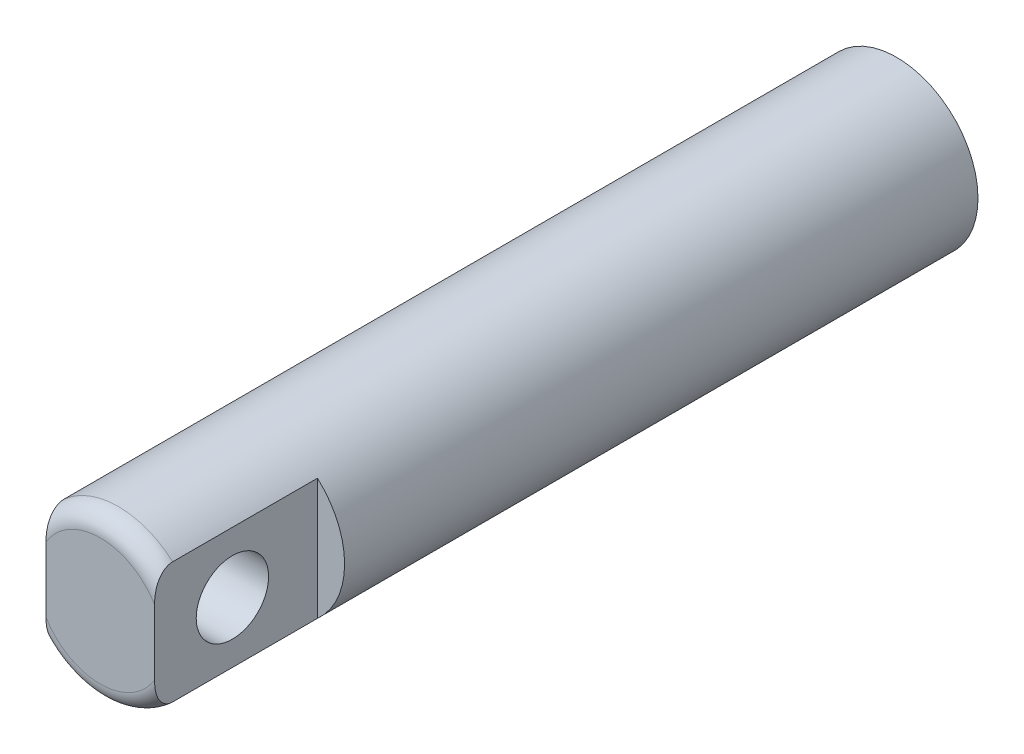
ISO-10303-21;
HEADER;
FILE_DESCRIPTION(('STEP AP214'),'2;1');
FILE_NAME('part.step','',(''),(''),'','','');
FILE_SCHEMA(('AUTOMOTIVE_DESIGN { 1 0 10303 214 1 1 1 1 }'));
ENDSEC;
DATA;
#1=APPLICATION_CONTEXT('core data for automotive mechanical design processes');
#2=APPLICATION_PROTOCOL_DEFINITION('international standard','automotive_design',2000,#1);
#3=PRODUCT_CONTEXT('',#1,'mechanical');
#4=PRODUCT('Part','Part','',(#3));
#5=PRODUCT_RELATED_PRODUCT_CATEGORY('part','',(#4));
#6=PRODUCT_DEFINITION_FORMATION('','',#4);
#7=PRODUCT_DEFINITION_CONTEXT('part definition',#1,'design');
#8=PRODUCT_DEFINITION('design','',#6,#7);
#9=PRODUCT_DEFINITION_SHAPE('','',#8);
#10=(LENGTH_UNIT() NAMED_UNIT(*) SI_UNIT(.MILLI.,.METRE.));
#11=(NAMED_UNIT(*) PLANE_ANGLE_UNIT() SI_UNIT($,.RADIAN.));
#12=(NAMED_UNIT(*) SI_UNIT($,.STERADIAN.) SOLID_ANGLE_UNIT());
#13=UNCERTAINTY_MEASURE_WITH_UNIT(LENGTH_MEASURE(1.E-05),#10,'distance_accuracy_value','');
#14=(GEOMETRIC_REPRESENTATION_CONTEXT(3) GLOBAL_UNCERTAINTY_ASSIGNED_CONTEXT((#13)) GLOBAL_UNIT_ASSIGNED_CONTEXT((#10,
#11,#12)) REPRESENTATION_CONTEXT('',''));
#15=CARTESIAN_POINT('',(0.,0.,0.));
#16=DIRECTION('',(0.,0.,1.));
#17=DIRECTION('',(1.,0.,0.));
#18=AXIS2_PLACEMENT_3D('',#15,#16,#17);
#19=CARTESIAN_POINT('',(0.,0.,35.));
#20=DIRECTION('',(0.,0.,1.));
#21=DIRECTION('',(1.,0.,0.));
#22=AXIS2_PLACEMENT_3D('',#19,#20,#21);
#23=PLANE('',#22);
#24=CARTESIAN_POINT('',(0.,0.,35.));
#25=DIRECTION('',(0.,0.,1.));
#26=DIRECTION('',(1.,0.,0.));
#27=AXIS2_PLACEMENT_3D('',#24,#25,#26);
#28=CIRCLE('',#27,4.5);
#29=CARTESIAN_POINT('',(-3.,3.35410196624968,35.));
#30=VERTEX_POINT('',#29);
#31=CARTESIAN_POINT('',(-3.,-3.35410196624968,35.));
#32=VERTEX_POINT('',#31);
#33=EDGE_CURVE('E97',#30,#32,#28,.T.);
#34=ORIENTED_EDGE('',*,*,#33,.T.);
#35=DIRECTION('',(0.,1.,0.));
#36=VECTOR('',#35,1.);
#37=CARTESIAN_POINT('',(-3.,0.,35.));
#38=LINE('',#37,#36);
#39=EDGE_CURVE('E103',#32,#30,#38,.T.);
#40=ORIENTED_EDGE('',*,*,#39,.T.);
#41=EDGE_LOOP('',(#34,#40));
#42=FACE_BOUND('',#41,.T.);
#43=ADVANCED_FACE('F36',(#42),#23,.T.);
#44=CARTESIAN_POINT('',(0.,0.,35.));
#45=DIRECTION('',(0.,0.,-1.));
#46=DIRECTION('',(-1.,0.,0.));
#47=AXIS2_PLACEMENT_3D('',#44,#45,#46);
#48=CYLINDRICAL_SURFACE('',#47,4.5);
#49=DIRECTION('',(0.,0.,-1.));
#50=VECTOR('',#49,1.);
#51=CARTESIAN_POINT('',(3.,-3.35410196624968,44.));
#52=LINE('',#51,#50);
#53=CARTESIAN_POINT('',(3.,-3.35410196624968,43.));
#54=VERTEX_POINT('',#53);
#55=CARTESIAN_POINT('',(3.,-3.35410196624968,35.));
#56=VERTEX_POINT('',#55);
#57=EDGE_CURVE('E100',#54,#56,#52,.T.);
#58=ORIENTED_EDGE('',*,*,#57,.F.);
#59=CARTESIAN_POINT('',(0.,0.,43.));
#60=DIRECTION('',(0.,0.,1.));
#61=DIRECTION('',(1.,0.,0.));
#62=AXIS2_PLACEMENT_3D('',#59,#60,#61);
#63=CIRCLE('',#62,4.5);
#64=CARTESIAN_POINT('',(-3.,-3.35410196624968,43.));
#65=VERTEX_POINT('',#64);
#66=EDGE_CURVE('E57',#54,#65,#63,.F.);
#67=ORIENTED_EDGE('',*,*,#66,.T.);
#68=DIRECTION('',(0.,0.,-1.));
#69=VECTOR('',#68,1.);
#70=CARTESIAN_POINT('',(-3.,-3.35410196624968,44.));
#71=LINE('',#70,#69);
#72=EDGE_CURVE('E92',#65,#32,#71,.T.);
#73=ORIENTED_EDGE('',*,*,#72,.T.);
#74=ORIENTED_EDGE('',*,*,#33,.F.);
#75=DIRECTION('',(0.,0.,-1.));
#76=VECTOR('',#75,1.);
#77=CARTESIAN_POINT('',(-3.,3.35410196624968,44.));
#78=LINE('',#77,#76);
#79=CARTESIAN_POINT('',(-3.,3.35410196624968,43.));
#80=VERTEX_POINT('',#79);
#81=EDGE_CURVE('E99',#80,#30,#78,.T.);
#82=ORIENTED_EDGE('',*,*,#81,.F.);
#83=CARTESIAN_POINT('',(0.,0.,43.));
#84=DIRECTION('',(0.,0.,1.));
#85=DIRECTION('',(1.,0.,0.));
#86=AXIS2_PLACEMENT_3D('',#83,#84,#85);
#87=CIRCLE('',#86,4.5);
#88=CARTESIAN_POINT('',(3.,3.35410196624968,43.));
#89=VERTEX_POINT('',#88);
#90=EDGE_CURVE('E160',#80,#89,#87,.F.);
#91=ORIENTED_EDGE('',*,*,#90,.T.);
#92=DIRECTION('',(0.,0.,-1.));
#93=VECTOR('',#92,1.);
#94=CARTESIAN_POINT('',(3.,3.35410196624968,44.));
#95=LINE('',#94,#93);
#96=CARTESIAN_POINT('',(3.,3.35410196624968,35.));
#97=VERTEX_POINT('',#96);
#98=EDGE_CURVE('E172',#89,#97,#95,.T.);
#99=ORIENTED_EDGE('',*,*,#98,.T.);
#100=EDGE_CURVE('E110',#56,#97,#28,.T.);
#101=ORIENTED_EDGE('',*,*,#100,.F.);
#102=EDGE_LOOP('',(#58,#67,#73,#74,#82,#91,#99,#101));
#103=FACE_BOUND('',#102,.T.);
#104=CARTESIAN_POINT('',(0.,0.,0.));
#105=DIRECTION('',(0.,0.,1.));
#106=DIRECTION('',(1.,0.,0.));
#107=AXIS2_PLACEMENT_3D('',#104,#105,#106);
#108=CIRCLE('',#107,4.5);
#109=CARTESIAN_POINT('',(4.5,0.,0.));
#110=VERTEX_POINT('',#109);
#111=EDGE_CURVE('E116',#110,#110,#108,.T.);
#112=ORIENTED_EDGE('',*,*,#111,.T.);
#113=EDGE_LOOP('',(#112));
#114=FACE_BOUND('',#113,.T.);
#115=ADVANCED_FACE('F94',(#103,#114),#48,.T.);
#116=DIRECTION('',(0.,1.,0.));
#117=VECTOR('',#116,1.);
#118=CARTESIAN_POINT('',(3.,0.,35.));
#119=LINE('',#118,#117);
#120=EDGE_CURVE('E106',#56,#97,#119,.T.);
#121=ORIENTED_EDGE('',*,*,#120,.F.);
#122=ORIENTED_EDGE('',*,*,#100,.T.);
#123=EDGE_LOOP('',(#121,#122));
#124=FACE_BOUND('',#123,.T.);
#125=ADVANCED_FACE('F152',(#124),#23,.T.);
#126=CARTESIAN_POINT('',(0.,0.,0.));
#127=DIRECTION('',(0.,0.,1.));
#128=DIRECTION('',(1.,0.,0.));
#129=AXIS2_PLACEMENT_3D('',#126,#127,#128);
#130=PLANE('',#129);
#131=ORIENTED_EDGE('',*,*,#111,.F.);
#132=EDGE_LOOP('',(#131));
#133=FACE_BOUND('',#132,.T.);
#134=ADVANCED_FACE('F150',(#133),#130,.F.);
#135=CARTESIAN_POINT('',(-3.,0.,44.));
#136=DIRECTION('',(-1.,0.,0.));
#137=DIRECTION('',(0.,0.,1.));
#138=AXIS2_PLACEMENT_3D('',#135,#136,#137);
#139=PLANE('',#138);
#140=CARTESIAN_POINT('',(-3.,0.,39.7));
#141=DIRECTION('',(-1.,0.,0.));
#142=DIRECTION('',(0.,0.,1.));
#143=AXIS2_PLACEMENT_3D('',#140,#141,#142);
#144=CIRCLE('',#143,2.);
#145=CARTESIAN_POINT('',(-3.,0.,41.7));
#146=VERTEX_POINT('',#145);
#147=EDGE_CURVE('E122',#146,#146,#144,.T.);
#148=ORIENTED_EDGE('',*,*,#147,.F.);
#149=EDGE_LOOP('',(#148));
#150=FACE_BOUND('',#149,.T.);
#151=ORIENTED_EDGE('',*,*,#72,.F.);
#152=CARTESIAN_POINT('',(-3.,-3.35410196624968,43.));
#153=CARTESIAN_POINT('',(-3.,-3.35410454903501,43.0227438625371));
#154=CARTESIAN_POINT('',(-3.,-3.35306009469318,43.0454749001638));
#155=CARTESIAN_POINT('',(-3.,-3.34891222657833,43.0907369708359));
#156=CARTESIAN_POINT('',(-3.,-3.34580985988294,43.1132680996912));
#157=CARTESIAN_POINT('',(-3.,-3.33352701165953,43.1800084670912));
#158=CARTESIAN_POINT('',(-3.,-3.32136959422299,43.2237015706051));
#159=CARTESIAN_POINT('',(-3.,-3.28985961248155,43.3082718676722));
#160=CARTESIAN_POINT('',(-3.,-3.27051886023211,43.3491535541598));
#161=CARTESIAN_POINT('',(-3.,-3.22563998320875,43.4274112040965));
#162=CARTESIAN_POINT('',(-3.,-3.20009153278447,43.4647811811681));
#163=CARTESIAN_POINT('',(-3.,-3.13519094673913,43.5464202089613));
#164=CARTESIAN_POINT('',(-3.,-3.09401470318977,43.5892380899997));
#165=CARTESIAN_POINT('',(-3.,-3.00528363023168,43.6675578784426));
#166=CARTESIAN_POINT('',(-3.,-2.95772326044216,43.7030533625526));
#167=CARTESIAN_POINT('',(-3.,-2.83879019866428,43.7794086367998));
#168=CARTESIAN_POINT('',(-3.,-2.76533540443195,43.8170109743537));
#169=CARTESIAN_POINT('',(-3.,-2.61322737961961,43.880326582716));
#170=CARTESIAN_POINT('',(-3.,-2.53454852125631,43.9059753973865));
#171=CARTESIAN_POINT('',(-3.,-2.34752333041213,43.9540625323204));
#172=CARTESIAN_POINT('',(-3.,-2.23815778385163,43.9724682091914));
#173=CARTESIAN_POINT('',(-3.,-2.07412278259901,43.9896598751466));
#174=CARTESIAN_POINT('',(-3.,-2.01986832136679,43.9936624497555));
#175=CARTESIAN_POINT('',(-3.,-1.91133646557868,43.9988264692374));
#176=CARTESIAN_POINT('',(-3.,-1.85705936934241,43.9999939844098));
#177=CARTESIAN_POINT('',(-3.,-1.80277563773199,44.));
#178=B_SPLINE_CURVE_WITH_KNOTS('',3,(#152,#153,#154,#155,#156,#157,#158,#159,#160,#161,#162,
#163,#164,#165,#166,#167,#168,#169,#170,#171,#172,#173,#174,#175,#176,#177),.UNSPECIFIED.,.F.,
.F.,(4,2,2,2,2,2,2,2,2,2,2,2,4),(0.,0.0681829439020982,0.136331222513028,0.271631980301874,
0.406711231656837,0.542016725653646,0.71925550854727,0.896649112429326,1.14283280088189,
1.39032903241819,1.72168681209064,1.88484827723546,2.04766007927172),.UNSPECIFIED.);
#179=CARTESIAN_POINT('',(-3.,-1.80277563773199,44.));
#180=VERTEX_POINT('',#179);
#181=EDGE_CURVE('E11',#65,#180,#178,.T.);
#182=ORIENTED_EDGE('',*,*,#181,.T.);
#183=DIRECTION('',(0.,1.,0.));
#184=VECTOR('',#183,1.);
#185=CARTESIAN_POINT('',(-3.,0.,44.));
#186=LINE('',#185,#184);
#187=CARTESIAN_POINT('',(-3.,1.80277563773199,44.));
#188=VERTEX_POINT('',#187);
#189=EDGE_CURVE('E176',#180,#188,#186,.T.);
#190=ORIENTED_EDGE('',*,*,#189,.T.);
#191=CARTESIAN_POINT('',(-3.,1.80277563773199,44.));
#192=CARTESIAN_POINT('',(-3.,1.86473915398204,43.999992786479));
#193=CARTESIAN_POINT('',(-3.,1.92675064852258,43.998470309225));
#194=CARTESIAN_POINT('',(-3.,2.05078914657058,43.9916379862247));
#195=CARTESIAN_POINT('',(-3.,2.11281534388827,43.9863140239824));
#196=CARTESIAN_POINT('',(-3.,2.23730506733931,43.9709914155777));
#197=CARTESIAN_POINT('',(-3.,2.29976017305419,43.9609206962147));
#198=CARTESIAN_POINT('',(-3.,2.42344502058643,43.9352569685175));
#199=CARTESIAN_POINT('',(-3.,2.48467656789302,43.9196728475899));
#200=CARTESIAN_POINT('',(-3.,2.61234803113835,43.879881616112));
#201=CARTESIAN_POINT('',(-3.,2.67854464930529,43.8548711675459));
#202=CARTESIAN_POINT('',(-3.,2.80653228228508,43.7957666283954));
#203=CARTESIAN_POINT('',(-3.,2.86834066349,43.7617112040979));
#204=CARTESIAN_POINT('',(-3.,2.97499791757549,43.6904697403969));
#205=CARTESIAN_POINT('',(-3.,3.02091493708341,43.6548963353062));
#206=CARTESIAN_POINT('',(-3.,3.10641620747324,43.5767219196394));
#207=CARTESIAN_POINT('',(-3.,3.14600368922408,43.5341245171163));
#208=CARTESIAN_POINT('',(-3.,3.20989194457622,43.4510406302771));
#209=CARTESIAN_POINT('',(-3.,3.23566809737303,43.4116915806997));
#210=CARTESIAN_POINT('',(-3.,3.28033489364886,43.3292989581221));
#211=CARTESIAN_POINT('',(-3.,3.29923796793242,43.286262230769));
#212=CARTESIAN_POINT('',(-3.,3.32720196702575,43.2030734135597));
#213=CARTESIAN_POINT('',(-3.,3.33720012624133,43.1632367881499));
#214=CARTESIAN_POINT('',(-3.,3.350694048589,43.0822883550148));
#215=CARTESIAN_POINT('',(-3.,3.35415849349146,43.0411713609915));
#216=CARTESIAN_POINT('',(-3.,3.35410196624968,43.));
#217=B_SPLINE_CURVE_WITH_KNOTS('',3,(#191,#192,#193,#194,#195,#196,#197,#198,#199,#200,#201,
#202,#203,#204,#205,#206,#207,#208,#209,#210,#211,#212,#213,#214,#215,#216),.UNSPECIFIED.,.F.,
.F.,(4,2,2,2,2,2,2,2,2,2,2,2,4),(0.,0.185944339614068,0.372582783121774,0.562151158963106,
0.751415339320557,0.963120760811107,1.17393533831198,1.34755258569099,1.52108092644838,
1.66162972471974,1.80192304372537,1.92461580338895,2.04789518942633),.UNSPECIFIED.);
#218=EDGE_CURVE('E50',#188,#80,#217,.T.);
#219=ORIENTED_EDGE('',*,*,#218,.T.);
#220=ORIENTED_EDGE('',*,*,#81,.T.);
#221=ORIENTED_EDGE('',*,*,#39,.F.);
#222=EDGE_LOOP('',(#151,#182,#190,#219,#220,#221));
#223=FACE_BOUND('',#222,.T.);
#224=ADVANCED_FACE('F104',(#150,#223),#139,.T.);
#225=CARTESIAN_POINT('',(3.,0.,44.));
#226=DIRECTION('',(-1.,0.,0.));
#227=DIRECTION('',(0.,0.,1.));
#228=AXIS2_PLACEMENT_3D('',#225,#226,#227);
#229=PLANE('',#228);
#230=CARTESIAN_POINT('',(3.,0.,39.7));
#231=DIRECTION('',(-1.,0.,0.));
#232=DIRECTION('',(0.,0.,1.));
#233=AXIS2_PLACEMENT_3D('',#230,#231,#232);
#234=CIRCLE('',#233,2.);
#235=CARTESIAN_POINT('',(3.,0.,41.7));
#236=VERTEX_POINT('',#235);
#237=EDGE_CURVE('E107',#236,#236,#234,.T.);
#238=ORIENTED_EDGE('',*,*,#237,.T.);
#239=EDGE_LOOP('',(#238));
#240=FACE_BOUND('',#239,.T.);
#241=DIRECTION('',(0.,1.,0.));
#242=VECTOR('',#241,1.);
#243=CARTESIAN_POINT('',(3.,0.,44.));
#244=LINE('',#243,#242);
#245=CARTESIAN_POINT('',(3.,-1.80277563773199,44.));
#246=VERTEX_POINT('',#245);
#247=CARTESIAN_POINT('',(3.,1.80277563773199,44.));
#248=VERTEX_POINT('',#247);
#249=EDGE_CURVE('E168',#246,#248,#244,.T.);
#250=ORIENTED_EDGE('',*,*,#249,.F.);
#251=CARTESIAN_POINT('',(3.,-1.80277563773199,44.));
#252=CARTESIAN_POINT('',(3.,-1.86473915398204,43.999992786479));
#253=CARTESIAN_POINT('',(3.,-1.92675064852258,43.998470309225));
#254=CARTESIAN_POINT('',(3.,-2.05078914657058,43.9916379862247));
#255=CARTESIAN_POINT('',(3.,-2.11281534388827,43.9863140239824));
#256=CARTESIAN_POINT('',(3.,-2.23730506733931,43.9709914155777));
#257=CARTESIAN_POINT('',(3.,-2.29976017305419,43.9609206962147));
#258=CARTESIAN_POINT('',(3.,-2.42344502058643,43.9352569685175));
#259=CARTESIAN_POINT('',(3.,-2.48467656789302,43.9196728475899));
#260=CARTESIAN_POINT('',(3.,-2.61234803113835,43.879881616112));
#261=CARTESIAN_POINT('',(3.,-2.67854464930529,43.8548711675459));
#262=CARTESIAN_POINT('',(3.,-2.80653228228508,43.7957666283954));
#263=CARTESIAN_POINT('',(3.,-2.86834066349,43.7617112040979));
#264=CARTESIAN_POINT('',(3.,-2.97499791757549,43.6904697403969));
#265=CARTESIAN_POINT('',(3.,-3.02091493708341,43.6548963353062));
#266=CARTESIAN_POINT('',(3.,-3.10641620747324,43.5767219196394));
#267=CARTESIAN_POINT('',(3.,-3.14600368922408,43.5341245171163));
#268=CARTESIAN_POINT('',(3.,-3.20989194457622,43.4510406302771));
#269=CARTESIAN_POINT('',(3.,-3.23566809737303,43.4116915806997));
#270=CARTESIAN_POINT('',(3.,-3.28033489364886,43.3292989581221));
#271=CARTESIAN_POINT('',(3.,-3.29923796793242,43.286262230769));
#272=CARTESIAN_POINT('',(3.,-3.32720196702575,43.2030734135597));
#273=CARTESIAN_POINT('',(3.,-3.33720012624133,43.1632367881499));
#274=CARTESIAN_POINT('',(3.,-3.350694048589,43.0822883550148));
#275=CARTESIAN_POINT('',(3.,-3.35415849349146,43.0411713609915));
#276=CARTESIAN_POINT('',(3.,-3.35410196624968,43.));
#277=B_SPLINE_CURVE_WITH_KNOTS('',3,(#251,#252,#253,#254,#255,#256,#257,#258,#259,#260,#261,
#262,#263,#264,#265,#266,#267,#268,#269,#270,#271,#272,#273,#274,#275,#276),.UNSPECIFIED.,.F.,
.F.,(4,2,2,2,2,2,2,2,2,2,2,2,4),(0.,0.185944339614068,0.372582783121774,0.562151158963106,
0.751415339320557,0.963120760811107,1.17393533831198,1.34755258569099,1.52108092644838,
1.66162972471974,1.80192304372537,1.92461580338895,2.04789518942633),.UNSPECIFIED.);
#278=EDGE_CURVE('E133',#246,#54,#277,.T.);
#279=ORIENTED_EDGE('',*,*,#278,.T.);
#280=ORIENTED_EDGE('',*,*,#57,.T.);
#281=ORIENTED_EDGE('',*,*,#120,.T.);
#282=ORIENTED_EDGE('',*,*,#98,.F.);
#283=CARTESIAN_POINT('',(3.,3.35410196624968,43.));
#284=CARTESIAN_POINT('',(3.,3.35410454903501,43.0227438625371));
#285=CARTESIAN_POINT('',(3.,3.35306009469318,43.0454749001638));
#286=CARTESIAN_POINT('',(3.,3.34891222657833,43.0907369708359));
#287=CARTESIAN_POINT('',(3.,3.34580985988294,43.1132680996912));
#288=CARTESIAN_POINT('',(3.,3.33352701165953,43.1800084670912));
#289=CARTESIAN_POINT('',(3.,3.32136959422299,43.2237015706051));
#290=CARTESIAN_POINT('',(3.,3.28985961248155,43.3082718676722));
#291=CARTESIAN_POINT('',(3.,3.27051886023211,43.3491535541598));
#292=CARTESIAN_POINT('',(3.,3.22563998320875,43.4274112040965));
#293=CARTESIAN_POINT('',(3.,3.20009153278447,43.4647811811681));
#294=CARTESIAN_POINT('',(3.,3.13519094673913,43.5464202089613));
#295=CARTESIAN_POINT('',(3.,3.09401470318977,43.5892380899997));
#296=CARTESIAN_POINT('',(3.,3.00528363023168,43.6675578784426));
#297=CARTESIAN_POINT('',(3.,2.95772326044216,43.7030533625526));
#298=CARTESIAN_POINT('',(3.,2.83879019866428,43.7794086367998));
#299=CARTESIAN_POINT('',(3.,2.76533540443195,43.8170109743537));
#300=CARTESIAN_POINT('',(3.,2.61322737961961,43.880326582716));
#301=CARTESIAN_POINT('',(3.,2.53454852125631,43.9059753973865));
#302=CARTESIAN_POINT('',(3.,2.34752333041213,43.9540625323204));
#303=CARTESIAN_POINT('',(3.,2.23815778385163,43.9724682091914));
#304=CARTESIAN_POINT('',(3.,2.07412278259901,43.9896598751466));
#305=CARTESIAN_POINT('',(3.,2.01986832136679,43.9936624497555));
#306=CARTESIAN_POINT('',(3.,1.91133646557868,43.9988264692374));
#307=CARTESIAN_POINT('',(3.,1.85705936934241,43.9999939844098));
#308=CARTESIAN_POINT('',(3.,1.80277563773199,44.));
#309=B_SPLINE_CURVE_WITH_KNOTS('',3,(#283,#284,#285,#286,#287,#288,#289,#290,#291,#292,#293,
#294,#295,#296,#297,#298,#299,#300,#301,#302,#303,#304,#305,#306,#307,#308),.UNSPECIFIED.,.F.,
.F.,(4,2,2,2,2,2,2,2,2,2,2,2,4),(0.,0.0681829439020982,0.136331222513028,0.271631980301874,
0.406711231656837,0.542016725653646,0.71925550854727,0.896649112429326,1.14283280088189,
1.39032903241819,1.72168681209064,1.88484827723546,2.04766007927172),.UNSPECIFIED.);
#310=EDGE_CURVE('E126',#89,#248,#309,.T.);
#311=ORIENTED_EDGE('',*,*,#310,.T.);
#312=EDGE_LOOP('',(#250,#279,#280,#281,#282,#311));
#313=FACE_BOUND('',#312,.T.);
#314=ADVANCED_FACE('F139',(#240,#313),#229,.F.);
#315=CARTESIAN_POINT('',(0.,0.,44.));
#316=DIRECTION('',(0.,0.,1.));
#317=DIRECTION('',(1.,0.,0.));
#318=AXIS2_PLACEMENT_3D('',#315,#316,#317);
#319=PLANE('',#318);
#320=ORIENTED_EDGE('',*,*,#189,.F.);
#321=CARTESIAN_POINT('',(0.,0.,44.));
#322=DIRECTION('',(0.,0.,1.));
#323=DIRECTION('',(1.,0.,0.));
#324=AXIS2_PLACEMENT_3D('',#321,#322,#323);
#325=CIRCLE('',#324,3.5);
#326=EDGE_CURVE('E113',#180,#246,#325,.T.);
#327=ORIENTED_EDGE('',*,*,#326,.T.);
#328=ORIENTED_EDGE('',*,*,#249,.T.);
#329=CARTESIAN_POINT('',(0.,0.,44.));
#330=DIRECTION('',(0.,0.,1.));
#331=DIRECTION('',(1.,0.,0.));
#332=AXIS2_PLACEMENT_3D('',#329,#330,#331);
#333=CIRCLE('',#332,3.5);
#334=EDGE_CURVE('E109',#248,#188,#333,.T.);
#335=ORIENTED_EDGE('',*,*,#334,.T.);
#336=EDGE_LOOP('',(#320,#327,#328,#335));
#337=FACE_BOUND('',#336,.T.);
#338=ADVANCED_FACE('F143',(#337),#319,.T.);
#339=CARTESIAN_POINT('',(4.5,0.,39.7));
#340=DIRECTION('',(-1.,0.,0.));
#341=DIRECTION('',(0.,0.,1.));
#342=AXIS2_PLACEMENT_3D('',#339,#340,#341);
#343=CYLINDRICAL_SURFACE('',#342,2.);
#344=ORIENTED_EDGE('',*,*,#147,.T.);
#345=EDGE_LOOP('',(#344));
#346=FACE_BOUND('',#345,.T.);
#347=ORIENTED_EDGE('',*,*,#237,.F.);
#348=EDGE_LOOP('',(#347));
#349=FACE_BOUND('',#348,.T.);
#350=ADVANCED_FACE('F209',(#346,#349),#343,.F.);
#351=CARTESIAN_POINT('',(0.,0.,43.));
#352=DIRECTION('',(0.,0.,1.));
#353=DIRECTION('',(1.,0.,0.));
#354=AXIS2_PLACEMENT_3D('',#351,#352,#353);
#355=TOROIDAL_SURFACE('',#354,3.5,1.);
#356=ORIENTED_EDGE('',*,*,#181,.F.);
#357=ORIENTED_EDGE('',*,*,#66,.F.);
#358=ORIENTED_EDGE('',*,*,#278,.F.);
#359=ORIENTED_EDGE('',*,*,#326,.F.);
#360=EDGE_LOOP('',(#356,#357,#358,#359));
#361=FACE_BOUND('',#360,.T.);
#362=ADVANCED_FACE('F174',(#361),#355,.T.);
#363=CARTESIAN_POINT('',(0.,0.,43.));
#364=DIRECTION('',(0.,0.,1.));
#365=DIRECTION('',(1.,0.,0.));
#366=AXIS2_PLACEMENT_3D('',#363,#364,#365);
#367=TOROIDAL_SURFACE('',#366,3.5,1.);
#368=ORIENTED_EDGE('',*,*,#310,.F.);
#369=ORIENTED_EDGE('',*,*,#90,.F.);
#370=ORIENTED_EDGE('',*,*,#218,.F.);
#371=ORIENTED_EDGE('',*,*,#334,.F.);
#372=EDGE_LOOP('',(#368,#369,#370,#371));
#373=FACE_BOUND('',#372,.T.);
#374=ADVANCED_FACE('F38',(#373),#367,.T.);
#375=CLOSED_SHELL('',(#43,#115,#125,#134,#224,#314,#338,#350,#362,#374));
#376=MANIFOLD_SOLID_BREP('B2',#375);
#377=ADVANCED_BREP_SHAPE_REPRESENTATION('',(#18,#376),#14);
#378=SHAPE_DEFINITION_REPRESENTATION(#9,#377);
ENDSEC;
END-ISO-10303-21;
